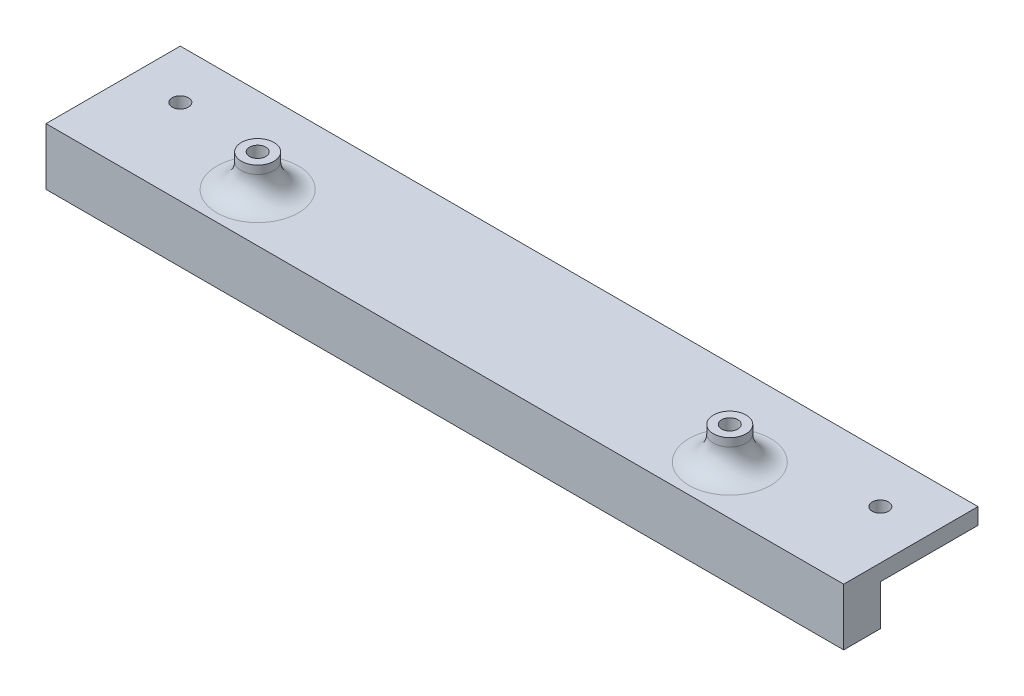
ISO-10303-21;
HEADER;
FILE_DESCRIPTION(('STEP AP214'),'2;1');
FILE_NAME('part.step','',(''),(''),'','','');
FILE_SCHEMA(('AUTOMOTIVE_DESIGN { 1 0 10303 214 1 1 1 1 }'));
ENDSEC;
DATA;
#1=APPLICATION_CONTEXT('core data for automotive mechanical design processes');
#2=APPLICATION_PROTOCOL_DEFINITION('international standard','automotive_design',2000,#1);
#3=PRODUCT_CONTEXT('',#1,'mechanical');
#4=PRODUCT('Part','Part','',(#3));
#5=PRODUCT_RELATED_PRODUCT_CATEGORY('part','',(#4));
#6=PRODUCT_DEFINITION_FORMATION('','',#4);
#7=PRODUCT_DEFINITION_CONTEXT('part definition',#1,'design');
#8=PRODUCT_DEFINITION('design','',#6,#7);
#9=PRODUCT_DEFINITION_SHAPE('','',#8);
#10=(LENGTH_UNIT() NAMED_UNIT(*) SI_UNIT(.MILLI.,.METRE.));
#11=(NAMED_UNIT(*) PLANE_ANGLE_UNIT() SI_UNIT($,.RADIAN.));
#12=(NAMED_UNIT(*) SI_UNIT($,.STERADIAN.) SOLID_ANGLE_UNIT());
#13=UNCERTAINTY_MEASURE_WITH_UNIT(LENGTH_MEASURE(1.E-05),#10,'distance_accuracy_value','');
#14=(GEOMETRIC_REPRESENTATION_CONTEXT(3) GLOBAL_UNCERTAINTY_ASSIGNED_CONTEXT((#13)) GLOBAL_UNIT_ASSIGNED_CONTEXT((#10,
#11,#12)) REPRESENTATION_CONTEXT('',''));
#15=CARTESIAN_POINT('',(0.,0.,0.));
#16=DIRECTION('',(0.,0.,1.));
#17=DIRECTION('',(1.,0.,0.));
#18=AXIS2_PLACEMENT_3D('',#15,#16,#17);
#19=CARTESIAN_POINT('',(0.,5.,-17.5));
#20=DIRECTION('',(0.,0.,-1.));
#21=DIRECTION('',(-1.,0.,0.));
#22=AXIS2_PLACEMENT_3D('',#19,#20,#21);
#23=PLANE('',#22);
#24=DIRECTION('',(-1.,0.,0.));
#25=VECTOR('',#24,1.);
#26=CARTESIAN_POINT('',(0.,10.,-17.5));
#27=LINE('',#26,#25);
#28=CARTESIAN_POINT('',(93.99999964,10.,-17.5));
#29=VERTEX_POINT('',#28);
#30=CARTESIAN_POINT('',(81.99999964,10.,-17.5));
#31=VERTEX_POINT('',#30);
#32=EDGE_CURVE('E169',#29,#31,#27,.T.);
#33=ORIENTED_EDGE('',*,*,#32,.F.);
#34=DIRECTION('',(0.,1.,0.));
#35=VECTOR('',#34,1.);
#36=CARTESIAN_POINT('',(93.99999964,5.,-17.5));
#37=LINE('',#36,#35);
#38=CARTESIAN_POINT('',(93.99999964,5.,-17.5));
#39=VERTEX_POINT('',#38);
#40=EDGE_CURVE('E53',#39,#29,#37,.T.);
#41=ORIENTED_EDGE('',*,*,#40,.F.);
#42=DIRECTION('',(-1.,0.,0.));
#43=VECTOR('',#42,1.);
#44=CARTESIAN_POINT('',(0.,5.,-17.5));
#45=LINE('',#44,#43);
#46=CARTESIAN_POINT('',(81.99999964,5.,-17.5));
#47=VERTEX_POINT('',#46);
#48=EDGE_CURVE('E170',#39,#47,#45,.T.);
#49=ORIENTED_EDGE('',*,*,#48,.T.);
#50=DIRECTION('',(0.,1.,0.));
#51=VECTOR('',#50,1.);
#52=CARTESIAN_POINT('',(81.99999964,5.,-17.5));
#53=LINE('',#52,#51);
#54=EDGE_CURVE('E193',#47,#31,#53,.T.);
#55=ORIENTED_EDGE('',*,*,#54,.T.);
#56=EDGE_LOOP('',(#33,#41,#49,#55));
#57=FACE_BOUND('',#56,.T.);
#58=ADVANCED_FACE('F37',(#57),#23,.T.);
#59=CARTESIAN_POINT('',(93.99999964,5.,0.));
#60=DIRECTION('',(-1.,0.,0.));
#61=DIRECTION('',(0.,0.,1.));
#62=AXIS2_PLACEMENT_3D('',#59,#60,#61);
#63=PLANE('',#62);
#64=ORIENTED_EDGE('',*,*,#40,.T.);
#65=DIRECTION('',(0.,0.,1.));
#66=VECTOR('',#65,1.);
#67=CARTESIAN_POINT('',(93.99999964,10.,0.));
#68=LINE('',#67,#66);
#69=CARTESIAN_POINT('',(93.99999964,10.,-29.5));
#70=VERTEX_POINT('',#69);
#71=EDGE_CURVE('E158',#70,#29,#68,.T.);
#72=ORIENTED_EDGE('',*,*,#71,.F.);
#73=DIRECTION('',(0.,-1.,0.));
#74=VECTOR('',#73,1.);
#75=CARTESIAN_POINT('',(93.99999964,12.,-29.5));
#76=LINE('',#75,#74);
#77=CARTESIAN_POINT('',(93.99999964,12.,-29.5));
#78=VERTEX_POINT('',#77);
#79=EDGE_CURVE('E166',#78,#70,#76,.T.);
#80=ORIENTED_EDGE('',*,*,#79,.F.);
#81=DIRECTION('',(0.,0.,1.));
#82=VECTOR('',#81,1.);
#83=CARTESIAN_POINT('',(93.99999964,12.,0.));
#84=LINE('',#83,#82);
#85=CARTESIAN_POINT('',(93.99999964,12.,-12.9994509035283));
#86=VERTEX_POINT('',#85);
#87=EDGE_CURVE('E132',#78,#86,#84,.T.);
#88=ORIENTED_EDGE('',*,*,#87,.T.);
#89=DIRECTION('',(0.,1.,0.));
#90=VECTOR('',#89,1.);
#91=CARTESIAN_POINT('',(93.99999964,5.,-12.9994509035283));
#92=LINE('',#91,#90);
#93=CARTESIAN_POINT('',(93.99999964,5.,-12.9994509035283));
#94=VERTEX_POINT('',#93);
#95=EDGE_CURVE('E122',#94,#86,#92,.T.);
#96=ORIENTED_EDGE('',*,*,#95,.F.);
#97=DIRECTION('',(0.,0.,1.));
#98=VECTOR('',#97,1.);
#99=CARTESIAN_POINT('',(93.99999964,5.,0.));
#100=LINE('',#99,#98);
#101=EDGE_CURVE('E185',#39,#94,#100,.T.);
#102=ORIENTED_EDGE('',*,*,#101,.F.);
#103=EDGE_LOOP('',(#64,#72,#80,#88,#96,#102));
#104=FACE_BOUND('',#103,.T.);
#105=ADVANCED_FACE('F269',(#104),#63,.F.);
#106=CARTESIAN_POINT('',(0.,5.,-12.9994509035283));
#107=DIRECTION('',(0.,0.,1.));
#108=DIRECTION('',(1.,0.,0.));
#109=AXIS2_PLACEMENT_3D('',#106,#107,#108);
#110=PLANE('',#109);
#111=ORIENTED_EDGE('',*,*,#95,.T.);
#112=DIRECTION('',(1.,0.,0.));
#113=VECTOR('',#112,1.);
#114=CARTESIAN_POINT('',(0.,12.,-12.9994509035283));
#115=LINE('',#114,#113);
#116=CARTESIAN_POINT('',(-3.99999964,12.,-12.9994509035283));
#117=VERTEX_POINT('',#116);
#118=EDGE_CURVE('E126',#117,#86,#115,.T.);
#119=ORIENTED_EDGE('',*,*,#118,.F.);
#120=DIRECTION('',(0.,1.,0.));
#121=VECTOR('',#120,1.);
#122=CARTESIAN_POINT('',(-3.99999964,5.,-12.9994509035283));
#123=LINE('',#122,#121);
#124=CARTESIAN_POINT('',(-3.99999964,5.,-12.9994509035283));
#125=VERTEX_POINT('',#124);
#126=EDGE_CURVE('E111',#125,#117,#123,.T.);
#127=ORIENTED_EDGE('',*,*,#126,.F.);
#128=DIRECTION('',(1.,0.,0.));
#129=VECTOR('',#128,1.);
#130=CARTESIAN_POINT('',(0.,5.,-12.9994509035283));
#131=LINE('',#130,#129);
#132=EDGE_CURVE('E183',#125,#94,#131,.T.);
#133=ORIENTED_EDGE('',*,*,#132,.T.);
#134=EDGE_LOOP('',(#111,#119,#127,#133));
#135=FACE_BOUND('',#134,.T.);
#136=ADVANCED_FACE('F127',(#135),#110,.T.);
#137=CARTESIAN_POINT('',(-3.99999964,5.,0.));
#138=DIRECTION('',(-1.,0.,0.));
#139=DIRECTION('',(0.,0.,1.));
#140=AXIS2_PLACEMENT_3D('',#137,#138,#139);
#141=PLANE('',#140);
#142=ORIENTED_EDGE('',*,*,#126,.T.);
#143=DIRECTION('',(0.,0.,1.));
#144=VECTOR('',#143,1.);
#145=CARTESIAN_POINT('',(-3.99999964,12.,0.));
#146=LINE('',#145,#144);
#147=CARTESIAN_POINT('',(-3.99999964,12.,-29.5));
#148=VERTEX_POINT('',#147);
#149=EDGE_CURVE('E115',#148,#117,#146,.T.);
#150=ORIENTED_EDGE('',*,*,#149,.F.);
#151=DIRECTION('',(0.,-1.,0.));
#152=VECTOR('',#151,1.);
#153=CARTESIAN_POINT('',(-3.99999964,12.,-29.5));
#154=LINE('',#153,#152);
#155=CARTESIAN_POINT('',(-3.99999964,10.,-29.5));
#156=VERTEX_POINT('',#155);
#157=EDGE_CURVE('E150',#148,#156,#154,.T.);
#158=ORIENTED_EDGE('',*,*,#157,.T.);
#159=DIRECTION('',(0.,0.,1.));
#160=VECTOR('',#159,1.);
#161=CARTESIAN_POINT('',(-3.99999964,10.,0.));
#162=LINE('',#161,#160);
#163=CARTESIAN_POINT('',(-3.99999964,10.,-17.5));
#164=VERTEX_POINT('',#163);
#165=EDGE_CURVE('E154',#156,#164,#162,.T.);
#166=ORIENTED_EDGE('',*,*,#165,.T.);
#167=DIRECTION('',(0.,1.,0.));
#168=VECTOR('',#167,1.);
#169=CARTESIAN_POINT('',(-3.99999964,5.,-17.5));
#170=LINE('',#169,#168);
#171=CARTESIAN_POINT('',(-3.99999964,5.,-17.5));
#172=VERTEX_POINT('',#171);
#173=EDGE_CURVE('E123',#172,#164,#170,.T.);
#174=ORIENTED_EDGE('',*,*,#173,.F.);
#175=DIRECTION('',(0.,0.,1.));
#176=VECTOR('',#175,1.);
#177=CARTESIAN_POINT('',(-3.99999964,5.,0.));
#178=LINE('',#177,#176);
#179=EDGE_CURVE('E118',#172,#125,#178,.T.);
#180=ORIENTED_EDGE('',*,*,#179,.T.);
#181=EDGE_LOOP('',(#142,#150,#158,#166,#174,#180));
#182=FACE_BOUND('',#181,.T.);
#183=ADVANCED_FACE('F113',(#182),#141,.T.);
#184=CARTESIAN_POINT('',(0.,5.,-17.5));
#185=DIRECTION('',(0.,0.,1.));
#186=DIRECTION('',(1.,0.,0.));
#187=AXIS2_PLACEMENT_3D('',#184,#185,#186);
#188=PLANE('',#187);
#189=DIRECTION('',(1.,0.,0.));
#190=VECTOR('',#189,1.);
#191=CARTESIAN_POINT('',(0.,10.,-17.5));
#192=LINE('',#191,#190);
#193=CARTESIAN_POINT('',(8.00000036,10.,-17.5));
#194=VERTEX_POINT('',#193);
#195=EDGE_CURVE('E173',#164,#194,#192,.T.);
#196=ORIENTED_EDGE('',*,*,#195,.T.);
#197=DIRECTION('',(0.,1.,0.));
#198=VECTOR('',#197,1.);
#199=CARTESIAN_POINT('',(8.00000036,5.,-17.5));
#200=LINE('',#199,#198);
#201=CARTESIAN_POINT('',(8.00000036,5.,-17.5));
#202=VERTEX_POINT('',#201);
#203=EDGE_CURVE('E207',#202,#194,#200,.T.);
#204=ORIENTED_EDGE('',*,*,#203,.F.);
#205=DIRECTION('',(1.,0.,0.));
#206=VECTOR('',#205,1.);
#207=CARTESIAN_POINT('',(0.,5.,-17.5));
#208=LINE('',#207,#206);
#209=EDGE_CURVE('E180',#172,#202,#208,.T.);
#210=ORIENTED_EDGE('',*,*,#209,.F.);
#211=ORIENTED_EDGE('',*,*,#173,.T.);
#212=EDGE_LOOP('',(#196,#204,#210,#211));
#213=FACE_BOUND('',#212,.T.);
#214=ADVANCED_FACE('F290',(#213),#188,.F.);
#215=CARTESIAN_POINT('',(8.00000036,5.,0.));
#216=DIRECTION('',(1.,0.,0.));
#217=DIRECTION('',(0.,0.,-1.));
#218=AXIS2_PLACEMENT_3D('',#215,#216,#217);
#219=PLANE('',#218);
#220=DIRECTION('',(0.,0.,-1.));
#221=VECTOR('',#220,1.);
#222=CARTESIAN_POINT('',(8.00000036,10.,0.));
#223=LINE('',#222,#221);
#224=CARTESIAN_POINT('',(8.00000036,10.,-29.5));
#225=VERTEX_POINT('',#224);
#226=EDGE_CURVE('E197',#194,#225,#223,.T.);
#227=ORIENTED_EDGE('',*,*,#226,.T.);
#228=DIRECTION('',(0.,1.,0.));
#229=VECTOR('',#228,1.);
#230=CARTESIAN_POINT('',(8.00000036,5.,-29.5));
#231=LINE('',#230,#229);
#232=CARTESIAN_POINT('',(8.00000036,5.,-29.5));
#233=VERTEX_POINT('',#232);
#234=EDGE_CURVE('E210',#233,#225,#231,.T.);
#235=ORIENTED_EDGE('',*,*,#234,.F.);
#236=DIRECTION('',(0.,0.,-1.));
#237=VECTOR('',#236,1.);
#238=CARTESIAN_POINT('',(8.00000036,5.,0.));
#239=LINE('',#238,#237);
#240=EDGE_CURVE('E178',#202,#233,#239,.T.);
#241=ORIENTED_EDGE('',*,*,#240,.F.);
#242=ORIENTED_EDGE('',*,*,#203,.T.);
#243=EDGE_LOOP('',(#227,#235,#241,#242));
#244=FACE_BOUND('',#243,.T.);
#245=ADVANCED_FACE('F286',(#244),#219,.F.);
#246=CARTESIAN_POINT('',(0.,5.,-29.5));
#247=DIRECTION('',(0.,0.,1.));
#248=DIRECTION('',(1.,0.,0.));
#249=AXIS2_PLACEMENT_3D('',#246,#247,#248);
#250=PLANE('',#249);
#251=ORIENTED_EDGE('',*,*,#234,.T.);
#252=DIRECTION('',(1.,0.,0.));
#253=VECTOR('',#252,1.);
#254=CARTESIAN_POINT('',(0.,10.,-29.5));
#255=LINE('',#254,#253);
#256=EDGE_CURVE('E161',#156,#225,#255,.T.);
#257=ORIENTED_EDGE('',*,*,#256,.F.);
#258=ORIENTED_EDGE('',*,*,#157,.F.);
#259=DIRECTION('',(1.,0.,0.));
#260=VECTOR('',#259,1.);
#261=CARTESIAN_POINT('',(0.,12.,-29.5));
#262=LINE('',#261,#260);
#263=EDGE_CURVE('E137',#148,#78,#262,.T.);
#264=ORIENTED_EDGE('',*,*,#263,.T.);
#265=ORIENTED_EDGE('',*,*,#79,.T.);
#266=CARTESIAN_POINT('',(81.99999964,10.,-29.5));
#267=VERTEX_POINT('',#266);
#268=EDGE_CURVE('E160',#267,#70,#255,.T.);
#269=ORIENTED_EDGE('',*,*,#268,.F.);
#270=DIRECTION('',(0.,1.,0.));
#271=VECTOR('',#270,1.);
#272=CARTESIAN_POINT('',(81.99999964,5.,-29.5));
#273=LINE('',#272,#271);
#274=CARTESIAN_POINT('',(81.99999964,5.,-29.5));
#275=VERTEX_POINT('',#274);
#276=EDGE_CURVE('E213',#275,#267,#273,.T.);
#277=ORIENTED_EDGE('',*,*,#276,.F.);
#278=DIRECTION('',(1.,0.,0.));
#279=VECTOR('',#278,1.);
#280=CARTESIAN_POINT('',(0.,5.,-29.5));
#281=LINE('',#280,#279);
#282=EDGE_CURVE('E176',#233,#275,#281,.T.);
#283=ORIENTED_EDGE('',*,*,#282,.F.);
#284=EDGE_LOOP('',(#251,#257,#258,#264,#265,#269,#277,#283));
#285=FACE_BOUND('',#284,.T.);
#286=ADVANCED_FACE('F283',(#285),#250,.F.);
#287=CARTESIAN_POINT('',(16.003399366993,5.,-18.9994509035283));
#288=DIRECTION('',(0.,1.,0.));
#289=DIRECTION('',(0.,0.,1.));
#290=AXIS2_PLACEMENT_3D('',#287,#288,#289);
#291=CYLINDRICAL_SURFACE('',#290,1.);
#292=CARTESIAN_POINT('',(16.003399366993,5.,-18.9994509035283));
#293=DIRECTION('',(0.,1.,0.));
#294=DIRECTION('',(0.,0.,1.));
#295=AXIS2_PLACEMENT_3D('',#292,#293,#294);
#296=CIRCLE('',#295,1.);
#297=CARTESIAN_POINT('',(16.003399366993,5.,-17.9994509035283));
#298=VERTEX_POINT('',#297);
#299=EDGE_CURVE('E187',#298,#298,#296,.T.);
#300=ORIENTED_EDGE('',*,*,#299,.F.);
#301=EDGE_LOOP('',(#300));
#302=FACE_BOUND('',#301,.T.);
#303=CARTESIAN_POINT('',(16.003399366993,16.,-18.9994509035283));
#304=DIRECTION('',(0.,1.,0.));
#305=DIRECTION('',(0.,0.,1.));
#306=AXIS2_PLACEMENT_3D('',#303,#304,#305);
#307=CIRCLE('',#306,1.);
#308=CARTESIAN_POINT('',(16.003399366993,16.,-17.9994509035283));
#309=VERTEX_POINT('',#308);
#310=EDGE_CURVE('E242',#309,#309,#307,.F.);
#311=ORIENTED_EDGE('',*,*,#310,.F.);
#312=EDGE_LOOP('',(#311));
#313=FACE_BOUND('',#312,.T.);
#314=ADVANCED_FACE('F281',(#302,#313),#291,.F.);
#315=CARTESIAN_POINT('',(81.99999964,5.,0.));
#316=DIRECTION('',(1.,0.,0.));
#317=DIRECTION('',(0.,0.,-1.));
#318=AXIS2_PLACEMENT_3D('',#315,#316,#317);
#319=PLANE('',#318);
#320=DIRECTION('',(0.,0.,-1.));
#321=VECTOR('',#320,1.);
#322=CARTESIAN_POINT('',(81.99999964,10.,0.));
#323=LINE('',#322,#321);
#324=EDGE_CURVE('E195',#31,#267,#323,.T.);
#325=ORIENTED_EDGE('',*,*,#324,.F.);
#326=ORIENTED_EDGE('',*,*,#54,.F.);
#327=DIRECTION('',(0.,0.,-1.));
#328=VECTOR('',#327,1.);
#329=CARTESIAN_POINT('',(81.99999964,5.,0.));
#330=LINE('',#329,#328);
#331=EDGE_CURVE('E172',#47,#275,#330,.T.);
#332=ORIENTED_EDGE('',*,*,#331,.T.);
#333=ORIENTED_EDGE('',*,*,#276,.T.);
#334=EDGE_LOOP('',(#325,#326,#332,#333));
#335=FACE_BOUND('',#334,.T.);
#336=ADVANCED_FACE('F277',(#335),#319,.T.);
#337=CARTESIAN_POINT('',(74.003399366993,5.,-18.9994509035283));
#338=DIRECTION('',(0.,1.,0.));
#339=DIRECTION('',(0.,0.,1.));
#340=AXIS2_PLACEMENT_3D('',#337,#338,#339);
#341=CYLINDRICAL_SURFACE('',#340,0.999999999999998);
#342=CARTESIAN_POINT('',(74.003399366993,5.,-18.9994509035283));
#343=DIRECTION('',(0.,1.,0.));
#344=DIRECTION('',(0.,0.,1.));
#345=AXIS2_PLACEMENT_3D('',#342,#343,#344);
#346=CIRCLE('',#345,0.999999999999998);
#347=CARTESIAN_POINT('',(74.003399366993,5.,-17.9994509035283));
#348=VERTEX_POINT('',#347);
#349=EDGE_CURVE('E190',#348,#348,#346,.T.);
#350=ORIENTED_EDGE('',*,*,#349,.F.);
#351=EDGE_LOOP('',(#350));
#352=FACE_BOUND('',#351,.T.);
#353=CARTESIAN_POINT('',(74.003399366993,16.,-18.9994509035283));
#354=DIRECTION('',(0.,1.,0.));
#355=DIRECTION('',(0.,0.,1.));
#356=AXIS2_PLACEMENT_3D('',#353,#354,#355);
#357=CIRCLE('',#356,0.999999999999998);
#358=CARTESIAN_POINT('',(74.003399366993,16.,-17.9994509035283));
#359=VERTEX_POINT('',#358);
#360=EDGE_CURVE('E243',#359,#359,#357,.F.);
#361=ORIENTED_EDGE('',*,*,#360,.F.);
#362=EDGE_LOOP('',(#361));
#363=FACE_BOUND('',#362,.T.);
#364=ADVANCED_FACE('F280',(#352,#363),#341,.F.);
#365=CARTESIAN_POINT('',(0.,5.,0.));
#366=DIRECTION('',(0.,1.,0.));
#367=DIRECTION('',(0.,0.,1.));
#368=AXIS2_PLACEMENT_3D('',#365,#366,#367);
#369=PLANE('',#368);
#370=ORIENTED_EDGE('',*,*,#48,.F.);
#371=ORIENTED_EDGE('',*,*,#101,.T.);
#372=ORIENTED_EDGE('',*,*,#132,.F.);
#373=ORIENTED_EDGE('',*,*,#179,.F.);
#374=ORIENTED_EDGE('',*,*,#209,.T.);
#375=ORIENTED_EDGE('',*,*,#240,.T.);
#376=ORIENTED_EDGE('',*,*,#282,.T.);
#377=ORIENTED_EDGE('',*,*,#331,.F.);
#378=EDGE_LOOP('',(#370,#371,#372,#373,#374,#375,#376,#377));
#379=FACE_BOUND('',#378,.T.);
#380=ORIENTED_EDGE('',*,*,#299,.T.);
#381=EDGE_LOOP('',(#380));
#382=FACE_BOUND('',#381,.T.);
#383=ORIENTED_EDGE('',*,*,#349,.T.);
#384=EDGE_LOOP('',(#383));
#385=FACE_BOUND('',#384,.T.);
#386=ADVANCED_FACE('F304',(#379,#382,#385),#369,.F.);
#387=CARTESIAN_POINT('',(0.,10.,0.));
#388=DIRECTION('',(0.,1.,0.));
#389=DIRECTION('',(0.,0.,1.));
#390=AXIS2_PLACEMENT_3D('',#387,#388,#389);
#391=PLANE('',#390);
#392=CARTESIAN_POINT('',(88.00000036,10.,-23.5));
#393=DIRECTION('',(0.,1.,0.));
#394=DIRECTION('',(0.,0.,1.));
#395=AXIS2_PLACEMENT_3D('',#392,#393,#394);
#396=CIRCLE('',#395,0.999999999999998);
#397=CARTESIAN_POINT('',(88.00000036,10.,-22.5));
#398=VERTEX_POINT('',#397);
#399=EDGE_CURVE('E141',#398,#398,#396,.T.);
#400=ORIENTED_EDGE('',*,*,#399,.T.);
#401=EDGE_LOOP('',(#400));
#402=FACE_BOUND('',#401,.T.);
#403=ORIENTED_EDGE('',*,*,#71,.T.);
#404=ORIENTED_EDGE('',*,*,#32,.T.);
#405=ORIENTED_EDGE('',*,*,#324,.T.);
#406=ORIENTED_EDGE('',*,*,#268,.T.);
#407=EDGE_LOOP('',(#403,#404,#405,#406));
#408=FACE_BOUND('',#407,.T.);
#409=ADVANCED_FACE('F266',(#402,#408),#391,.F.);
#410=CARTESIAN_POINT('',(88.00000036,12.,-23.5));
#411=DIRECTION('',(0.,-1.,0.));
#412=DIRECTION('',(0.,0.,-1.));
#413=AXIS2_PLACEMENT_3D('',#410,#411,#412);
#414=CYLINDRICAL_SURFACE('',#413,0.999999999999998);
#415=CARTESIAN_POINT('',(88.00000036,12.,-23.5));
#416=DIRECTION('',(0.,1.,0.));
#417=DIRECTION('',(0.,0.,1.));
#418=AXIS2_PLACEMENT_3D('',#415,#416,#417);
#419=CIRCLE('',#418,0.999999999999998);
#420=CARTESIAN_POINT('',(88.00000036,12.,-22.5));
#421=VERTEX_POINT('',#420);
#422=EDGE_CURVE('E147',#421,#421,#419,.T.);
#423=ORIENTED_EDGE('',*,*,#422,.T.);
#424=EDGE_LOOP('',(#423));
#425=FACE_BOUND('',#424,.T.);
#426=ORIENTED_EDGE('',*,*,#399,.F.);
#427=EDGE_LOOP('',(#426));
#428=FACE_BOUND('',#427,.T.);
#429=ADVANCED_FACE('F312',(#425,#428),#414,.F.);
#430=CARTESIAN_POINT('',(2.00000036,12.,-23.5));
#431=DIRECTION('',(0.,-1.,0.));
#432=DIRECTION('',(0.,0.,-1.));
#433=AXIS2_PLACEMENT_3D('',#430,#431,#432);
#434=CYLINDRICAL_SURFACE('',#433,1.);
#435=CARTESIAN_POINT('',(2.00000036,12.,-23.5));
#436=DIRECTION('',(0.,1.,0.));
#437=DIRECTION('',(0.,0.,1.));
#438=AXIS2_PLACEMENT_3D('',#435,#436,#437);
#439=CIRCLE('',#438,1.);
#440=CARTESIAN_POINT('',(2.00000036,12.,-22.5));
#441=VERTEX_POINT('',#440);
#442=EDGE_CURVE('E138',#441,#441,#439,.T.);
#443=ORIENTED_EDGE('',*,*,#442,.T.);
#444=EDGE_LOOP('',(#443));
#445=FACE_BOUND('',#444,.T.);
#446=CARTESIAN_POINT('',(2.00000036,10.,-23.5));
#447=DIRECTION('',(0.,1.,0.));
#448=DIRECTION('',(0.,0.,1.));
#449=AXIS2_PLACEMENT_3D('',#446,#447,#448);
#450=CIRCLE('',#449,1.);
#451=CARTESIAN_POINT('',(2.00000036,10.,-22.5));
#452=VERTEX_POINT('',#451);
#453=EDGE_CURVE('E151',#452,#452,#450,.T.);
#454=ORIENTED_EDGE('',*,*,#453,.F.);
#455=EDGE_LOOP('',(#454));
#456=FACE_BOUND('',#455,.T.);
#457=ADVANCED_FACE('F309',(#445,#456),#434,.F.);
#458=CARTESIAN_POINT('',(0.,12.,0.));
#459=DIRECTION('',(0.,1.,0.));
#460=DIRECTION('',(0.,0.,1.));
#461=AXIS2_PLACEMENT_3D('',#458,#459,#460);
#462=PLANE('',#461);
#463=CARTESIAN_POINT('',(74.003399366993,12.,-18.9994509035283));
#464=DIRECTION('',(0.,1.,0.));
#465=DIRECTION('',(0.,0.,1.));
#466=AXIS2_PLACEMENT_3D('',#463,#464,#465);
#467=CIRCLE('',#466,5.);
#468=CARTESIAN_POINT('',(74.003399366993,12.,-13.9994509035283));
#469=VERTEX_POINT('',#468);
#470=EDGE_CURVE('E46',#469,#469,#467,.F.);
#471=ORIENTED_EDGE('',*,*,#470,.T.);
#472=EDGE_LOOP('',(#471));
#473=FACE_BOUND('',#472,.T.);
#474=CARTESIAN_POINT('',(16.003399366993,12.,-18.9994509035283));
#475=DIRECTION('',(0.,1.,0.));
#476=DIRECTION('',(0.,0.,1.));
#477=AXIS2_PLACEMENT_3D('',#474,#475,#476);
#478=CIRCLE('',#477,5.);
#479=CARTESIAN_POINT('',(16.003399366993,12.,-13.9994509035283));
#480=VERTEX_POINT('',#479);
#481=EDGE_CURVE('E220',#480,#480,#478,.F.);
#482=ORIENTED_EDGE('',*,*,#481,.T.);
#483=EDGE_LOOP('',(#482));
#484=FACE_BOUND('',#483,.T.);
#485=ORIENTED_EDGE('',*,*,#442,.F.);
#486=EDGE_LOOP('',(#485));
#487=FACE_BOUND('',#486,.T.);
#488=ORIENTED_EDGE('',*,*,#149,.T.);
#489=ORIENTED_EDGE('',*,*,#118,.T.);
#490=ORIENTED_EDGE('',*,*,#87,.F.);
#491=ORIENTED_EDGE('',*,*,#263,.F.);
#492=EDGE_LOOP('',(#488,#489,#490,#491));
#493=FACE_BOUND('',#492,.T.);
#494=ORIENTED_EDGE('',*,*,#422,.F.);
#495=EDGE_LOOP('',(#494));
#496=FACE_BOUND('',#495,.T.);
#497=ADVANCED_FACE('F134',(#473,#484,#487,#493,#496),#462,.T.);
#498=ORIENTED_EDGE('',*,*,#226,.F.);
#499=ORIENTED_EDGE('',*,*,#195,.F.);
#500=ORIENTED_EDGE('',*,*,#165,.F.);
#501=ORIENTED_EDGE('',*,*,#256,.T.);
#502=EDGE_LOOP('',(#498,#499,#500,#501));
#503=FACE_BOUND('',#502,.T.);
#504=ORIENTED_EDGE('',*,*,#453,.T.);
#505=EDGE_LOOP('',(#504));
#506=FACE_BOUND('',#505,.T.);
#507=ADVANCED_FACE('F255',(#503,#506),#391,.F.);
#508=CARTESIAN_POINT('',(16.003399366993,16.,-18.9994509035283));
#509=DIRECTION('',(0.,-1.,0.));
#510=DIRECTION('',(0.,0.,-1.));
#511=AXIS2_PLACEMENT_3D('',#508,#509,#510);
#512=CYLINDRICAL_SURFACE('',#511,2.);
#513=CARTESIAN_POINT('',(16.003399366993,15.,-18.9994509035283));
#514=DIRECTION('',(0.,1.,0.));
#515=DIRECTION('',(0.,0.,1.));
#516=AXIS2_PLACEMENT_3D('',#513,#514,#515);
#517=CIRCLE('',#516,2.);
#518=CARTESIAN_POINT('',(16.003399366993,15.,-16.9994509035283));
#519=VERTEX_POINT('',#518);
#520=EDGE_CURVE('E11',#519,#519,#517,.T.);
#521=ORIENTED_EDGE('',*,*,#520,.T.);
#522=EDGE_LOOP('',(#521));
#523=FACE_BOUND('',#522,.T.);
#524=CARTESIAN_POINT('',(16.003399366993,16.,-18.9994509035283));
#525=DIRECTION('',(0.,1.,0.));
#526=DIRECTION('',(0.,0.,1.));
#527=AXIS2_PLACEMENT_3D('',#524,#525,#526);
#528=CIRCLE('',#527,2.);
#529=CARTESIAN_POINT('',(16.003399366993,16.,-16.9994509035283));
#530=VERTEX_POINT('',#529);
#531=EDGE_CURVE('E155',#530,#530,#528,.T.);
#532=ORIENTED_EDGE('',*,*,#531,.F.);
#533=EDGE_LOOP('',(#532));
#534=FACE_BOUND('',#533,.T.);
#535=ADVANCED_FACE('F253',(#523,#534),#512,.T.);
#536=CARTESIAN_POINT('',(0.,16.,0.));
#537=DIRECTION('',(0.,1.,0.));
#538=DIRECTION('',(0.,0.,1.));
#539=AXIS2_PLACEMENT_3D('',#536,#537,#538);
#540=PLANE('',#539);
#541=ORIENTED_EDGE('',*,*,#310,.T.);
#542=EDGE_LOOP('',(#541));
#543=FACE_BOUND('',#542,.T.);
#544=ORIENTED_EDGE('',*,*,#531,.T.);
#545=EDGE_LOOP('',(#544));
#546=FACE_BOUND('',#545,.T.);
#547=ADVANCED_FACE('F236',(#543,#546),#540,.T.);
#548=CARTESIAN_POINT('',(74.003399366993,16.,-18.9994509035283));
#549=DIRECTION('',(0.,-1.,0.));
#550=DIRECTION('',(0.,0.,-1.));
#551=AXIS2_PLACEMENT_3D('',#548,#549,#550);
#552=CYLINDRICAL_SURFACE('',#551,2.);
#553=CARTESIAN_POINT('',(74.003399366993,15.,-18.9994509035283));
#554=DIRECTION('',(0.,1.,0.));
#555=DIRECTION('',(0.,0.,1.));
#556=AXIS2_PLACEMENT_3D('',#553,#554,#555);
#557=CIRCLE('',#556,2.);
#558=CARTESIAN_POINT('',(74.003399366993,15.,-16.9994509035283));
#559=VERTEX_POINT('',#558);
#560=EDGE_CURVE('E203',#559,#559,#557,.T.);
#561=ORIENTED_EDGE('',*,*,#560,.T.);
#562=EDGE_LOOP('',(#561));
#563=FACE_BOUND('',#562,.T.);
#564=CARTESIAN_POINT('',(74.003399366993,16.,-18.9994509035283));
#565=DIRECTION('',(0.,1.,0.));
#566=DIRECTION('',(0.,0.,1.));
#567=AXIS2_PLACEMENT_3D('',#564,#565,#566);
#568=CIRCLE('',#567,2.);
#569=CARTESIAN_POINT('',(74.003399366993,16.,-16.9994509035283));
#570=VERTEX_POINT('',#569);
#571=EDGE_CURVE('E240',#570,#570,#568,.T.);
#572=ORIENTED_EDGE('',*,*,#571,.F.);
#573=EDGE_LOOP('',(#572));
#574=FACE_BOUND('',#573,.T.);
#575=ADVANCED_FACE('F233',(#563,#574),#552,.T.);
#576=CARTESIAN_POINT('',(0.,16.,0.));
#577=DIRECTION('',(0.,1.,0.));
#578=DIRECTION('',(0.,0.,1.));
#579=AXIS2_PLACEMENT_3D('',#576,#577,#578);
#580=PLANE('',#579);
#581=ORIENTED_EDGE('',*,*,#360,.T.);
#582=EDGE_LOOP('',(#581));
#583=FACE_BOUND('',#582,.T.);
#584=ORIENTED_EDGE('',*,*,#571,.T.);
#585=EDGE_LOOP('',(#584));
#586=FACE_BOUND('',#585,.T.);
#587=ADVANCED_FACE('F230',(#583,#586),#580,.T.);
#588=CARTESIAN_POINT('',(74.003399366993,15.,-18.9994509035283));
#589=DIRECTION('',(0.,1.,0.));
#590=DIRECTION('',(0.,0.,1.));
#591=AXIS2_PLACEMENT_3D('',#588,#589,#590);
#592=TOROIDAL_SURFACE('',#591,5.,3.);
#593=ORIENTED_EDGE('',*,*,#470,.F.);
#594=EDGE_LOOP('',(#593));
#595=FACE_BOUND('',#594,.T.);
#596=ORIENTED_EDGE('',*,*,#560,.F.);
#597=EDGE_LOOP('',(#596));
#598=FACE_BOUND('',#597,.T.);
#599=ADVANCED_FACE('F227',(#595,#598),#592,.F.);
#600=CARTESIAN_POINT('',(16.003399366993,15.,-18.9994509035283));
#601=DIRECTION('',(0.,1.,0.));
#602=DIRECTION('',(0.,0.,1.));
#603=AXIS2_PLACEMENT_3D('',#600,#601,#602);
#604=TOROIDAL_SURFACE('',#603,5.,3.);
#605=ORIENTED_EDGE('',*,*,#481,.F.);
#606=EDGE_LOOP('',(#605));
#607=FACE_BOUND('',#606,.T.);
#608=ORIENTED_EDGE('',*,*,#520,.F.);
#609=EDGE_LOOP('',(#608));
#610=FACE_BOUND('',#609,.T.);
#611=ADVANCED_FACE('F39',(#607,#610),#604,.F.);
#612=CLOSED_SHELL('',(#58,#105,#136,#183,#214,#245,#286,#314,#336,#364,#386,#409,#429,#457,#497,
#507,#535,#547,#575,#587,#599,#611));
#613=MANIFOLD_SOLID_BREP('B2',#612);
#614=ADVANCED_BREP_SHAPE_REPRESENTATION('',(#18,#613),#14);
#615=SHAPE_DEFINITION_REPRESENTATION(#9,#614);
ENDSEC;
END-ISO-10303-21;
